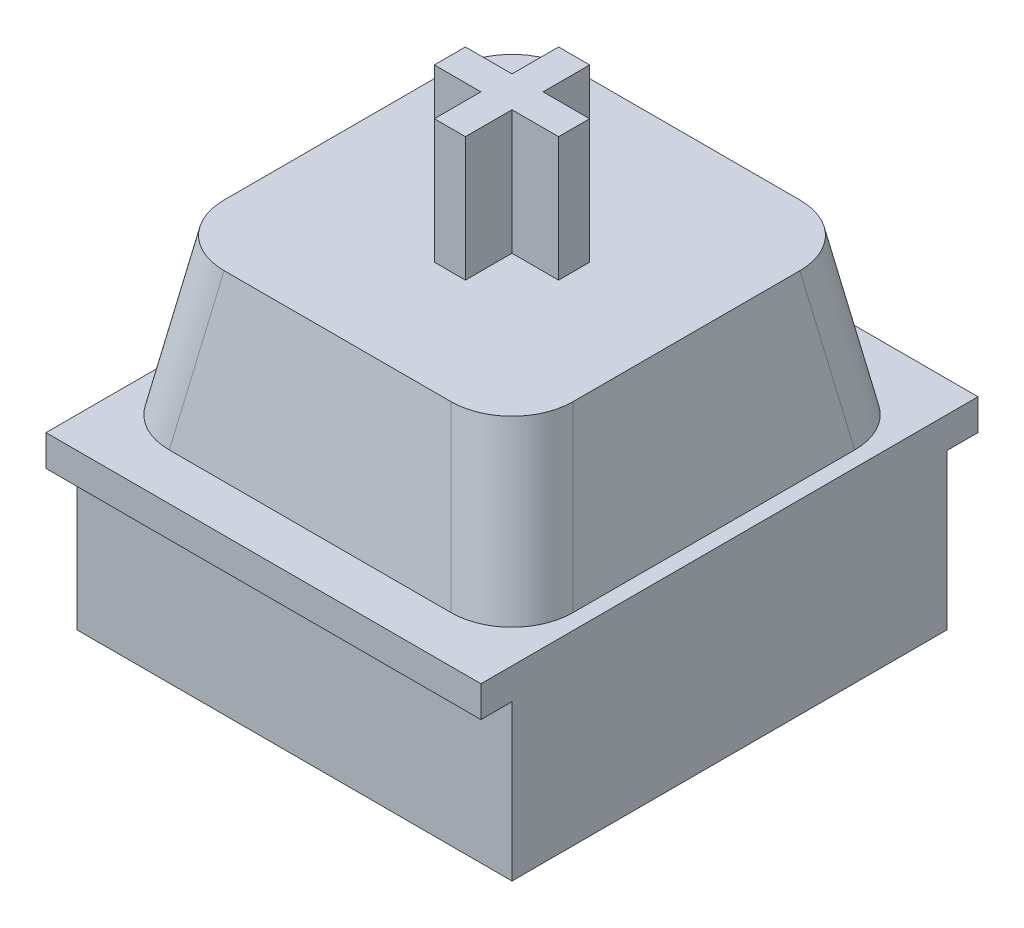
ISO-10303-21;
HEADER;
FILE_DESCRIPTION(('STEP AP214'),'2;1');
FILE_NAME('part.step','',(''),(''),'','','');
FILE_SCHEMA(('AUTOMOTIVE_DESIGN { 1 0 10303 214 1 1 1 1 }'));
ENDSEC;
DATA;
#1=APPLICATION_CONTEXT('core data for automotive mechanical design processes');
#2=APPLICATION_PROTOCOL_DEFINITION('international standard','automotive_design',2000,#1);
#3=PRODUCT_CONTEXT('',#1,'mechanical');
#4=PRODUCT('Part','Part','',(#3));
#5=PRODUCT_RELATED_PRODUCT_CATEGORY('part','',(#4));
#6=PRODUCT_DEFINITION_FORMATION('','',#4);
#7=PRODUCT_DEFINITION_CONTEXT('part definition',#1,'design');
#8=PRODUCT_DEFINITION('design','',#6,#7);
#9=PRODUCT_DEFINITION_SHAPE('','',#8);
#10=(LENGTH_UNIT() NAMED_UNIT(*) SI_UNIT(.MILLI.,.METRE.));
#11=(NAMED_UNIT(*) PLANE_ANGLE_UNIT() SI_UNIT($,.RADIAN.));
#12=(NAMED_UNIT(*) SI_UNIT($,.STERADIAN.) SOLID_ANGLE_UNIT());
#13=UNCERTAINTY_MEASURE_WITH_UNIT(LENGTH_MEASURE(1.E-05),#10,'distance_accuracy_value','');
#14=(GEOMETRIC_REPRESENTATION_CONTEXT(3) GLOBAL_UNCERTAINTY_ASSIGNED_CONTEXT((#13)) GLOBAL_UNIT_ASSIGNED_CONTEXT((#10,
#11,#12)) REPRESENTATION_CONTEXT('',''));
#15=CARTESIAN_POINT('',(0.,0.,0.));
#16=DIRECTION('',(0.,0.,1.));
#17=DIRECTION('',(1.,0.,0.));
#18=AXIS2_PLACEMENT_3D('',#15,#16,#17);
#19=CARTESIAN_POINT('',(0.,11.,0.));
#20=DIRECTION('',(0.,-1.,0.));
#21=DIRECTION('',(0.,0.,-1.));
#22=AXIS2_PLACEMENT_3D('',#19,#20,#21);
#23=PLANE('',#22);
#24=DIRECTION('',(0.,0.,1.));
#25=VECTOR('',#24,1.);
#26=CARTESIAN_POINT('',(5.61836509645767,11.,0.));
#27=LINE('',#26,#25);
#28=CARTESIAN_POINT('',(5.61836509645767,11.,3.64874959043326));
#29=VERTEX_POINT('',#28);
#30=CARTESIAN_POINT('',(5.61836509645767,11.,-3.64874959043326));
#31=VERTEX_POINT('',#30);
#32=EDGE_CURVE('E276',#29,#31,#27,.F.);
#33=ORIENTED_EDGE('',*,*,#32,.T.);
#34=CARTESIAN_POINT('',(3.58751187268619,11.,-3.58751187268618));
#35=DIRECTION('',(0.,-1.,0.));
#36=DIRECTION('',(0.707106781186548,0.,-0.707106781186548));
#37=AXIS2_PLACEMENT_3D('',#34,#35,#36);
#38=ELLIPSE('',#37,2.06124468052827,2.);
#39=CARTESIAN_POINT('',(3.64874959043326,11.,-5.61836509645767));
#40=VERTEX_POINT('',#39);
#41=EDGE_CURVE('E402',#31,#40,#38,.F.);
#42=ORIENTED_EDGE('',*,*,#41,.T.);
#43=DIRECTION('',(1.,0.,0.));
#44=VECTOR('',#43,1.);
#45=CARTESIAN_POINT('',(0.,11.,-5.61836509645767));
#46=LINE('',#45,#44);
#47=CARTESIAN_POINT('',(-3.64874959043326,11.,-5.61836509645767));
#48=VERTEX_POINT('',#47);
#49=EDGE_CURVE('E283',#40,#48,#46,.F.);
#50=ORIENTED_EDGE('',*,*,#49,.T.);
#51=CARTESIAN_POINT('',(-3.58751187268618,11.,-3.58751187268619));
#52=DIRECTION('',(0.,-1.,0.));
#53=DIRECTION('',(-0.707106781186548,0.,-0.707106781186548));
#54=AXIS2_PLACEMENT_3D('',#51,#52,#53);
#55=ELLIPSE('',#54,2.06124468052827,2.);
#56=CARTESIAN_POINT('',(-5.61836509645767,11.,-3.64874959043326));
#57=VERTEX_POINT('',#56);
#58=EDGE_CURVE('E391',#48,#57,#55,.F.);
#59=ORIENTED_EDGE('',*,*,#58,.T.);
#60=DIRECTION('',(0.,0.,-1.));
#61=VECTOR('',#60,1.);
#62=CARTESIAN_POINT('',(-5.61836509645767,11.,0.));
#63=LINE('',#62,#61);
#64=CARTESIAN_POINT('',(-5.61836509645767,11.,3.64874959043326));
#65=VERTEX_POINT('',#64);
#66=EDGE_CURVE('E290',#57,#65,#63,.F.);
#67=ORIENTED_EDGE('',*,*,#66,.T.);
#68=CARTESIAN_POINT('',(-3.58751187268619,11.,3.58751187268619));
#69=DIRECTION('',(0.,-1.,0.));
#70=DIRECTION('',(-0.707106781186548,0.,0.707106781186548));
#71=AXIS2_PLACEMENT_3D('',#68,#69,#70);
#72=ELLIPSE('',#71,2.06124468052827,2.);
#73=CARTESIAN_POINT('',(-3.64874959043326,11.,5.61836509645767));
#74=VERTEX_POINT('',#73);
#75=EDGE_CURVE('E395',#65,#74,#72,.F.);
#76=ORIENTED_EDGE('',*,*,#75,.T.);
#77=DIRECTION('',(-1.,0.,0.));
#78=VECTOR('',#77,1.);
#79=CARTESIAN_POINT('',(0.,11.,5.61836509645767));
#80=LINE('',#79,#78);
#81=CARTESIAN_POINT('',(3.64874959043326,11.,5.61836509645767));
#82=VERTEX_POINT('',#81);
#83=EDGE_CURVE('E293',#74,#82,#80,.F.);
#84=ORIENTED_EDGE('',*,*,#83,.T.);
#85=CARTESIAN_POINT('',(3.58751187268619,11.,3.58751187268619));
#86=DIRECTION('',(0.,-1.,0.));
#87=DIRECTION('',(0.707106781186548,0.,0.707106781186548));
#88=AXIS2_PLACEMENT_3D('',#85,#86,#87);
#89=ELLIPSE('',#88,2.06124468052827,2.);
#90=EDGE_CURVE('E397',#82,#29,#89,.F.);
#91=ORIENTED_EDGE('',*,*,#90,.T.);
#92=EDGE_LOOP('',(#33,#42,#50,#59,#67,#76,#84,#91));
#93=FACE_BOUND('',#92,.T.);
#94=DIRECTION('',(0.,0.,-1.));
#95=VECTOR('',#94,1.);
#96=CARTESIAN_POINT('',(0.5,11.,-0.5));
#97=LINE('',#96,#95);
#98=CARTESIAN_POINT('',(0.5,11.,-0.5));
#99=VERTEX_POINT('',#98);
#100=CARTESIAN_POINT('',(0.5,11.,-2.));
#101=VERTEX_POINT('',#100);
#102=EDGE_CURVE('E257',#99,#101,#97,.T.);
#103=ORIENTED_EDGE('',*,*,#102,.F.);
#104=DIRECTION('',(-1.,0.,0.));
#105=VECTOR('',#104,1.);
#106=CARTESIAN_POINT('',(2.,11.,-0.5));
#107=LINE('',#106,#105);
#108=CARTESIAN_POINT('',(2.,11.,-0.5));
#109=VERTEX_POINT('',#108);
#110=EDGE_CURVE('E254',#109,#99,#107,.T.);
#111=ORIENTED_EDGE('',*,*,#110,.F.);
#112=DIRECTION('',(0.,0.,-1.));
#113=VECTOR('',#112,1.);
#114=CARTESIAN_POINT('',(2.,11.,0.5));
#115=LINE('',#114,#113);
#116=CARTESIAN_POINT('',(2.,11.,0.5));
#117=VERTEX_POINT('',#116);
#118=EDGE_CURVE('E606',#117,#109,#115,.T.);
#119=ORIENTED_EDGE('',*,*,#118,.F.);
#120=DIRECTION('',(1.,0.,0.));
#121=VECTOR('',#120,1.);
#122=CARTESIAN_POINT('',(0.5,11.,0.5));
#123=LINE('',#122,#121);
#124=CARTESIAN_POINT('',(0.5,11.,0.5));
#125=VERTEX_POINT('',#124);
#126=EDGE_CURVE('E607',#125,#117,#123,.T.);
#127=ORIENTED_EDGE('',*,*,#126,.F.);
#128=DIRECTION('',(0.,0.,-1.));
#129=VECTOR('',#128,1.);
#130=CARTESIAN_POINT('',(0.5,11.,2.));
#131=LINE('',#130,#129);
#132=CARTESIAN_POINT('',(0.5,11.,2.));
#133=VERTEX_POINT('',#132);
#134=EDGE_CURVE('E605',#133,#125,#131,.T.);
#135=ORIENTED_EDGE('',*,*,#134,.F.);
#136=DIRECTION('',(1.,0.,0.));
#137=VECTOR('',#136,1.);
#138=CARTESIAN_POINT('',(-0.5,11.,2.));
#139=LINE('',#138,#137);
#140=CARTESIAN_POINT('',(-0.5,11.,2.));
#141=VERTEX_POINT('',#140);
#142=EDGE_CURVE('E596',#141,#133,#139,.T.);
#143=ORIENTED_EDGE('',*,*,#142,.F.);
#144=DIRECTION('',(0.,0.,1.));
#145=VECTOR('',#144,1.);
#146=CARTESIAN_POINT('',(-0.5,11.,0.5));
#147=LINE('',#146,#145);
#148=CARTESIAN_POINT('',(-0.5,11.,0.5));
#149=VERTEX_POINT('',#148);
#150=EDGE_CURVE('E593',#149,#141,#147,.T.);
#151=ORIENTED_EDGE('',*,*,#150,.F.);
#152=DIRECTION('',(1.,0.,0.));
#153=VECTOR('',#152,1.);
#154=CARTESIAN_POINT('',(-2.,11.,0.5));
#155=LINE('',#154,#153);
#156=CARTESIAN_POINT('',(-2.,11.,0.5));
#157=VERTEX_POINT('',#156);
#158=EDGE_CURVE('E586',#157,#149,#155,.T.);
#159=ORIENTED_EDGE('',*,*,#158,.F.);
#160=DIRECTION('',(0.,0.,1.));
#161=VECTOR('',#160,1.);
#162=CARTESIAN_POINT('',(-2.,11.,-0.5));
#163=LINE('',#162,#161);
#164=CARTESIAN_POINT('',(-2.,11.,-0.5));
#165=VERTEX_POINT('',#164);
#166=EDGE_CURVE('E587',#165,#157,#163,.T.);
#167=ORIENTED_EDGE('',*,*,#166,.F.);
#168=DIRECTION('',(-1.,0.,0.));
#169=VECTOR('',#168,1.);
#170=CARTESIAN_POINT('',(-0.5,11.,-0.5));
#171=LINE('',#170,#169);
#172=CARTESIAN_POINT('',(-0.5,11.,-0.5));
#173=VERTEX_POINT('',#172);
#174=EDGE_CURVE('E585',#173,#165,#171,.T.);
#175=ORIENTED_EDGE('',*,*,#174,.F.);
#176=DIRECTION('',(0.,0.,1.));
#177=VECTOR('',#176,1.);
#178=CARTESIAN_POINT('',(-0.5,11.,-2.));
#179=LINE('',#178,#177);
#180=CARTESIAN_POINT('',(-0.5,11.,-2.));
#181=VERTEX_POINT('',#180);
#182=EDGE_CURVE('E579',#181,#173,#179,.T.);
#183=ORIENTED_EDGE('',*,*,#182,.F.);
#184=DIRECTION('',(-1.,0.,0.));
#185=VECTOR('',#184,1.);
#186=CARTESIAN_POINT('',(0.5,11.,-2.));
#187=LINE('',#186,#185);
#188=EDGE_CURVE('E574',#101,#181,#187,.T.);
#189=ORIENTED_EDGE('',*,*,#188,.F.);
#190=EDGE_LOOP('',(#103,#111,#119,#127,#135,#143,#151,#159,#167,#175,#183,#189));
#191=FACE_BOUND('',#190,.T.);
#192=ADVANCED_FACE('F44',(#93,#191),#23,.F.);
#193=CARTESIAN_POINT('',(0.,6.,0.));
#194=DIRECTION('',(0.,-1.,0.));
#195=DIRECTION('',(0.,0.,-1.));
#196=AXIS2_PLACEMENT_3D('',#193,#194,#195);
#197=PLANE('',#196);
#198=DIRECTION('',(0.,0.,-1.));
#199=VECTOR('',#198,1.);
#200=CARTESIAN_POINT('',(7.,6.,8.));
#201=LINE('',#200,#199);
#202=CARTESIAN_POINT('',(7.,6.,8.));
#203=VERTEX_POINT('',#202);
#204=CARTESIAN_POINT('',(7.,6.,-8.));
#205=VERTEX_POINT('',#204);
#206=EDGE_CURVE('E298',#203,#205,#201,.T.);
#207=ORIENTED_EDGE('',*,*,#206,.T.);
#208=DIRECTION('',(-1.,0.,0.));
#209=VECTOR('',#208,1.);
#210=CARTESIAN_POINT('',(-7.,6.,-8.));
#211=LINE('',#210,#209);
#212=CARTESIAN_POINT('',(-7.,6.,-8.));
#213=VERTEX_POINT('',#212);
#214=EDGE_CURVE('E297',#205,#213,#211,.T.);
#215=ORIENTED_EDGE('',*,*,#214,.T.);
#216=DIRECTION('',(0.,0.,1.));
#217=VECTOR('',#216,1.);
#218=CARTESIAN_POINT('',(-7.,6.,8.));
#219=LINE('',#218,#217);
#220=CARTESIAN_POINT('',(-7.,6.,8.));
#221=VERTEX_POINT('',#220);
#222=EDGE_CURVE('E302',#213,#221,#219,.T.);
#223=ORIENTED_EDGE('',*,*,#222,.T.);
#224=DIRECTION('',(1.,0.,0.));
#225=VECTOR('',#224,1.);
#226=CARTESIAN_POINT('',(-7.,6.,8.));
#227=LINE('',#226,#225);
#228=EDGE_CURVE('E310',#221,#203,#227,.T.);
#229=ORIENTED_EDGE('',*,*,#228,.T.);
#230=EDGE_LOOP('',(#207,#215,#223,#229));
#231=FACE_BOUND('',#230,.T.);
#232=DIRECTION('',(0.,0.,-1.));
#233=VECTOR('',#232,1.);
#234=CARTESIAN_POINT('',(6.5,6.,6.5));
#235=LINE('',#234,#233);
#236=CARTESIAN_POINT('',(6.5,6.,4.53038449397558));
#237=VERTEX_POINT('',#236);
#238=CARTESIAN_POINT('',(6.5,6.,-4.53038449397558));
#239=VERTEX_POINT('',#238);
#240=EDGE_CURVE('E259',#237,#239,#235,.T.);
#241=ORIENTED_EDGE('',*,*,#240,.F.);
#242=CARTESIAN_POINT('',(4.46914677622851,6.,4.46914677622851));
#243=DIRECTION('',(0.,-1.,0.));
#244=DIRECTION('',(0.707106781186548,0.,0.707106781186548));
#245=AXIS2_PLACEMENT_3D('',#242,#243,#244);
#246=ELLIPSE('',#245,2.06124468052827,2.);
#247=CARTESIAN_POINT('',(4.53038449397558,6.,6.5));
#248=VERTEX_POINT('',#247);
#249=EDGE_CURVE('E419',#237,#248,#246,.T.);
#250=ORIENTED_EDGE('',*,*,#249,.T.);
#251=DIRECTION('',(1.,0.,0.));
#252=VECTOR('',#251,1.);
#253=CARTESIAN_POINT('',(-6.5,6.,6.5));
#254=LINE('',#253,#252);
#255=CARTESIAN_POINT('',(-4.53038449397558,6.,6.5));
#256=VERTEX_POINT('',#255);
#257=EDGE_CURVE('E273',#256,#248,#254,.T.);
#258=ORIENTED_EDGE('',*,*,#257,.F.);
#259=CARTESIAN_POINT('',(-4.46914677622851,6.,4.46914677622851));
#260=DIRECTION('',(0.,-1.,0.));
#261=DIRECTION('',(-0.707106781186548,0.,0.707106781186548));
#262=AXIS2_PLACEMENT_3D('',#259,#260,#261);
#263=ELLIPSE('',#262,2.06124468052827,2.);
#264=CARTESIAN_POINT('',(-6.5,6.,4.53038449397558));
#265=VERTEX_POINT('',#264);
#266=EDGE_CURVE('E11',#256,#265,#263,.T.);
#267=ORIENTED_EDGE('',*,*,#266,.T.);
#268=DIRECTION('',(0.,0.,1.));
#269=VECTOR('',#268,1.);
#270=CARTESIAN_POINT('',(-6.5,6.,6.5));
#271=LINE('',#270,#269);
#272=CARTESIAN_POINT('',(-6.5,6.,-4.53038449397558));
#273=VERTEX_POINT('',#272);
#274=EDGE_CURVE('E275',#273,#265,#271,.T.);
#275=ORIENTED_EDGE('',*,*,#274,.F.);
#276=CARTESIAN_POINT('',(-4.46914677622851,6.,-4.46914677622851));
#277=DIRECTION('',(0.,-1.,0.));
#278=DIRECTION('',(-0.707106781186548,0.,-0.707106781186548));
#279=AXIS2_PLACEMENT_3D('',#276,#277,#278);
#280=ELLIPSE('',#279,2.06124468052827,2.);
#281=CARTESIAN_POINT('',(-4.53038449397558,6.,-6.5));
#282=VERTEX_POINT('',#281);
#283=EDGE_CURVE('E53',#273,#282,#280,.T.);
#284=ORIENTED_EDGE('',*,*,#283,.T.);
#285=DIRECTION('',(-1.,0.,0.));
#286=VECTOR('',#285,1.);
#287=CARTESIAN_POINT('',(-6.5,6.,-6.5));
#288=LINE('',#287,#286);
#289=CARTESIAN_POINT('',(4.53038449397558,6.,-6.5));
#290=VERTEX_POINT('',#289);
#291=EDGE_CURVE('E263',#290,#282,#288,.T.);
#292=ORIENTED_EDGE('',*,*,#291,.F.);
#293=CARTESIAN_POINT('',(4.46914677622851,6.,-4.46914677622851));
#294=DIRECTION('',(0.,-1.,0.));
#295=DIRECTION('',(0.707106781186548,0.,-0.707106781186548));
#296=AXIS2_PLACEMENT_3D('',#293,#294,#295);
#297=ELLIPSE('',#296,2.06124468052827,2.);
#298=EDGE_CURVE('E420',#290,#239,#297,.T.);
#299=ORIENTED_EDGE('',*,*,#298,.T.);
#300=EDGE_LOOP('',(#241,#250,#258,#267,#275,#284,#292,#299));
#301=FACE_BOUND('',#300,.T.);
#302=ADVANCED_FACE('F424',(#231,#301),#197,.F.);
#303=CARTESIAN_POINT('',(7.,5.,7.));
#304=DIRECTION('',(-1.,0.,0.));
#305=DIRECTION('',(0.,0.,1.));
#306=AXIS2_PLACEMENT_3D('',#303,#304,#305);
#307=PLANE('',#306);
#308=DIRECTION('',(0.,0.,-1.));
#309=VECTOR('',#308,1.);
#310=CARTESIAN_POINT('',(7.,0.,7.));
#311=LINE('',#310,#309);
#312=CARTESIAN_POINT('',(7.,0.,7.));
#313=VERTEX_POINT('',#312);
#314=CARTESIAN_POINT('',(7.,0.,-7.));
#315=VERTEX_POINT('',#314);
#316=EDGE_CURVE('E338',#313,#315,#311,.T.);
#317=ORIENTED_EDGE('',*,*,#316,.T.);
#318=DIRECTION('',(0.,-1.,0.));
#319=VECTOR('',#318,1.);
#320=CARTESIAN_POINT('',(7.,5.,-7.));
#321=LINE('',#320,#319);
#322=CARTESIAN_POINT('',(7.,5.,-7.));
#323=VERTEX_POINT('',#322);
#324=EDGE_CURVE('E373',#323,#315,#321,.T.);
#325=ORIENTED_EDGE('',*,*,#324,.F.);
#326=DIRECTION('',(0.,0.,-1.));
#327=VECTOR('',#326,1.);
#328=CARTESIAN_POINT('',(7.,5.,8.));
#329=LINE('',#328,#327);
#330=CARTESIAN_POINT('',(7.,5.,-8.));
#331=VERTEX_POINT('',#330);
#332=EDGE_CURVE('E294',#323,#331,#329,.T.);
#333=ORIENTED_EDGE('',*,*,#332,.T.);
#334=DIRECTION('',(0.,-1.,0.));
#335=VECTOR('',#334,1.);
#336=CARTESIAN_POINT('',(7.,6.,-8.));
#337=LINE('',#336,#335);
#338=EDGE_CURVE('E337',#205,#331,#337,.T.);
#339=ORIENTED_EDGE('',*,*,#338,.F.);
#340=ORIENTED_EDGE('',*,*,#206,.F.);
#341=DIRECTION('',(0.,-1.,0.));
#342=VECTOR('',#341,1.);
#343=CARTESIAN_POINT('',(7.,6.,8.));
#344=LINE('',#343,#342);
#345=CARTESIAN_POINT('',(7.,5.,8.));
#346=VERTEX_POINT('',#345);
#347=EDGE_CURVE('E309',#203,#346,#344,.T.);
#348=ORIENTED_EDGE('',*,*,#347,.T.);
#349=CARTESIAN_POINT('',(7.,5.,7.));
#350=VERTEX_POINT('',#349);
#351=EDGE_CURVE('E311',#346,#350,#329,.T.);
#352=ORIENTED_EDGE('',*,*,#351,.T.);
#353=DIRECTION('',(0.,-1.,0.));
#354=VECTOR('',#353,1.);
#355=CARTESIAN_POINT('',(7.,5.,7.));
#356=LINE('',#355,#354);
#357=EDGE_CURVE('E346',#350,#313,#356,.T.);
#358=ORIENTED_EDGE('',*,*,#357,.T.);
#359=EDGE_LOOP('',(#317,#325,#333,#339,#340,#348,#352,#358));
#360=FACE_BOUND('',#359,.T.);
#361=ADVANCED_FACE('F471',(#360),#307,.F.);
#362=CARTESIAN_POINT('',(-7.,5.,-7.));
#363=DIRECTION('',(0.,0.,1.));
#364=DIRECTION('',(1.,0.,0.));
#365=AXIS2_PLACEMENT_3D('',#362,#363,#364);
#366=PLANE('',#365);
#367=DIRECTION('',(-1.,0.,0.));
#368=VECTOR('',#367,1.);
#369=CARTESIAN_POINT('',(-7.,0.,-7.));
#370=LINE('',#369,#368);
#371=CARTESIAN_POINT('',(-7.,0.,-7.));
#372=VERTEX_POINT('',#371);
#373=EDGE_CURVE('E353',#315,#372,#370,.T.);
#374=ORIENTED_EDGE('',*,*,#373,.T.);
#375=DIRECTION('',(0.,-1.,0.));
#376=VECTOR('',#375,1.);
#377=CARTESIAN_POINT('',(-7.,5.,-7.));
#378=LINE('',#377,#376);
#379=CARTESIAN_POINT('',(-7.,5.,-7.));
#380=VERTEX_POINT('',#379);
#381=EDGE_CURVE('E367',#380,#372,#378,.T.);
#382=ORIENTED_EDGE('',*,*,#381,.F.);
#383=DIRECTION('',(-1.,0.,0.));
#384=VECTOR('',#383,1.);
#385=CARTESIAN_POINT('',(-7.,5.,-7.));
#386=LINE('',#385,#384);
#387=EDGE_CURVE('E342',#323,#380,#386,.T.);
#388=ORIENTED_EDGE('',*,*,#387,.F.);
#389=ORIENTED_EDGE('',*,*,#324,.T.);
#390=EDGE_LOOP('',(#374,#382,#388,#389));
#391=FACE_BOUND('',#390,.T.);
#392=ADVANCED_FACE('F512',(#391),#366,.F.);
#393=CARTESIAN_POINT('',(-7.,5.,7.));
#394=DIRECTION('',(1.,0.,0.));
#395=DIRECTION('',(0.,0.,-1.));
#396=AXIS2_PLACEMENT_3D('',#393,#394,#395);
#397=PLANE('',#396);
#398=DIRECTION('',(0.,0.,1.));
#399=VECTOR('',#398,1.);
#400=CARTESIAN_POINT('',(-7.,0.,7.));
#401=LINE('',#400,#399);
#402=CARTESIAN_POINT('',(-7.,0.,7.));
#403=VERTEX_POINT('',#402);
#404=EDGE_CURVE('E357',#372,#403,#401,.T.);
#405=ORIENTED_EDGE('',*,*,#404,.T.);
#406=DIRECTION('',(0.,-1.,0.));
#407=VECTOR('',#406,1.);
#408=CARTESIAN_POINT('',(-7.,5.,7.));
#409=LINE('',#408,#407);
#410=CARTESIAN_POINT('',(-7.,5.,7.));
#411=VERTEX_POINT('',#410);
#412=EDGE_CURVE('E362',#411,#403,#409,.T.);
#413=ORIENTED_EDGE('',*,*,#412,.F.);
#414=DIRECTION('',(0.,0.,1.));
#415=VECTOR('',#414,1.);
#416=CARTESIAN_POINT('',(-7.,5.,8.));
#417=LINE('',#416,#415);
#418=CARTESIAN_POINT('',(-7.,5.,8.));
#419=VERTEX_POINT('',#418);
#420=EDGE_CURVE('E319',#411,#419,#417,.T.);
#421=ORIENTED_EDGE('',*,*,#420,.T.);
#422=DIRECTION('',(0.,-1.,0.));
#423=VECTOR('',#422,1.);
#424=CARTESIAN_POINT('',(-7.,6.,8.));
#425=LINE('',#424,#423);
#426=EDGE_CURVE('E328',#221,#419,#425,.T.);
#427=ORIENTED_EDGE('',*,*,#426,.F.);
#428=ORIENTED_EDGE('',*,*,#222,.F.);
#429=DIRECTION('',(0.,-1.,0.));
#430=VECTOR('',#429,1.);
#431=CARTESIAN_POINT('',(-7.,6.,-8.));
#432=LINE('',#431,#430);
#433=CARTESIAN_POINT('',(-7.,5.,-8.));
#434=VERTEX_POINT('',#433);
#435=EDGE_CURVE('E335',#213,#434,#432,.T.);
#436=ORIENTED_EDGE('',*,*,#435,.T.);
#437=EDGE_CURVE('E316',#434,#380,#417,.T.);
#438=ORIENTED_EDGE('',*,*,#437,.T.);
#439=ORIENTED_EDGE('',*,*,#381,.T.);
#440=EDGE_LOOP('',(#405,#413,#421,#427,#428,#436,#438,#439));
#441=FACE_BOUND('',#440,.T.);
#442=ADVANCED_FACE('F510',(#441),#397,.F.);
#443=CARTESIAN_POINT('',(-7.,5.,7.));
#444=DIRECTION('',(0.,0.,-1.));
#445=DIRECTION('',(-1.,0.,0.));
#446=AXIS2_PLACEMENT_3D('',#443,#444,#445);
#447=PLANE('',#446);
#448=DIRECTION('',(1.,0.,0.));
#449=VECTOR('',#448,1.);
#450=CARTESIAN_POINT('',(-7.,0.,7.));
#451=LINE('',#450,#449);
#452=EDGE_CURVE('E347',#403,#313,#451,.T.);
#453=ORIENTED_EDGE('',*,*,#452,.T.);
#454=ORIENTED_EDGE('',*,*,#357,.F.);
#455=DIRECTION('',(1.,0.,0.));
#456=VECTOR('',#455,1.);
#457=CARTESIAN_POINT('',(-7.,5.,7.));
#458=LINE('',#457,#456);
#459=EDGE_CURVE('E343',#411,#350,#458,.T.);
#460=ORIENTED_EDGE('',*,*,#459,.F.);
#461=ORIENTED_EDGE('',*,*,#412,.T.);
#462=EDGE_LOOP('',(#453,#454,#460,#461));
#463=FACE_BOUND('',#462,.T.);
#464=ADVANCED_FACE('F503',(#463),#447,.F.);
#465=CARTESIAN_POINT('',(0.,0.,0.));
#466=DIRECTION('',(0.,-1.,0.));
#467=DIRECTION('',(0.,0.,-1.));
#468=AXIS2_PLACEMENT_3D('',#465,#466,#467);
#469=PLANE('',#468);
#470=CARTESIAN_POINT('',(2.25,0.,-5.));
#471=DIRECTION('',(0.,-1.,0.));
#472=DIRECTION('',(0.,0.,-1.));
#473=AXIS2_PLACEMENT_3D('',#470,#471,#472);
#474=CIRCLE('',#473,0.750000000000001);
#475=CARTESIAN_POINT('',(2.25,0.,-5.75));
#476=VERTEX_POINT('',#475);
#477=EDGE_CURVE('E953',#476,#476,#474,.T.);
#478=ORIENTED_EDGE('',*,*,#477,.F.);
#479=EDGE_LOOP('',(#478));
#480=FACE_BOUND('',#479,.T.);
#481=CARTESIAN_POINT('',(-3.5,0.,-2.75));
#482=DIRECTION('',(0.,-1.,0.));
#483=DIRECTION('',(0.,0.,-1.));
#484=AXIS2_PLACEMENT_3D('',#481,#482,#483);
#485=CIRCLE('',#484,0.75);
#486=CARTESIAN_POINT('',(-3.5,0.,-3.5));
#487=VERTEX_POINT('',#486);
#488=EDGE_CURVE('E954',#487,#487,#485,.T.);
#489=ORIENTED_EDGE('',*,*,#488,.F.);
#490=EDGE_LOOP('',(#489));
#491=FACE_BOUND('',#490,.T.);
#492=CARTESIAN_POINT('',(0.,0.,0.));
#493=DIRECTION('',(0.,-1.,0.));
#494=DIRECTION('',(0.,0.,-1.));
#495=AXIS2_PLACEMENT_3D('',#492,#493,#494);
#496=CIRCLE('',#495,1.75);
#497=CARTESIAN_POINT('',(0.,0.,-1.75));
#498=VERTEX_POINT('',#497);
#499=EDGE_CURVE('E380',#498,#498,#496,.T.);
#500=ORIENTED_EDGE('',*,*,#499,.F.);
#501=EDGE_LOOP('',(#500));
#502=FACE_BOUND('',#501,.T.);
#503=ORIENTED_EDGE('',*,*,#316,.F.);
#504=ORIENTED_EDGE('',*,*,#452,.F.);
#505=ORIENTED_EDGE('',*,*,#404,.F.);
#506=ORIENTED_EDGE('',*,*,#373,.F.);
#507=EDGE_LOOP('',(#503,#504,#505,#506));
#508=FACE_BOUND('',#507,.T.);
#509=ADVANCED_FACE('F499',(#480,#491,#502,#508),#469,.T.);
#510=CARTESIAN_POINT('',(0.,5.,0.));
#511=DIRECTION('',(0.,-1.,0.));
#512=DIRECTION('',(0.,0.,-1.));
#513=AXIS2_PLACEMENT_3D('',#510,#511,#512);
#514=PLANE('',#513);
#515=ORIENTED_EDGE('',*,*,#332,.F.);
#516=ORIENTED_EDGE('',*,*,#387,.T.);
#517=ORIENTED_EDGE('',*,*,#437,.F.);
#518=DIRECTION('',(-1.,0.,0.));
#519=VECTOR('',#518,1.);
#520=CARTESIAN_POINT('',(-7.,5.,-8.));
#521=LINE('',#520,#519);
#522=EDGE_CURVE('E314',#331,#434,#521,.T.);
#523=ORIENTED_EDGE('',*,*,#522,.F.);
#524=EDGE_LOOP('',(#515,#516,#517,#523));
#525=FACE_BOUND('',#524,.T.);
#526=ADVANCED_FACE('F495',(#525),#514,.T.);
#527=CARTESIAN_POINT('',(-7.,6.,-8.));
#528=DIRECTION('',(0.,0.,1.));
#529=DIRECTION('',(1.,0.,0.));
#530=AXIS2_PLACEMENT_3D('',#527,#528,#529);
#531=PLANE('',#530);
#532=ORIENTED_EDGE('',*,*,#522,.T.);
#533=ORIENTED_EDGE('',*,*,#435,.F.);
#534=ORIENTED_EDGE('',*,*,#214,.F.);
#535=ORIENTED_EDGE('',*,*,#338,.T.);
#536=EDGE_LOOP('',(#532,#533,#534,#535));
#537=FACE_BOUND('',#536,.T.);
#538=ADVANCED_FACE('F492',(#537),#531,.F.);
#539=CARTESIAN_POINT('',(-7.,6.,8.));
#540=DIRECTION('',(0.,0.,-1.));
#541=DIRECTION('',(-1.,0.,0.));
#542=AXIS2_PLACEMENT_3D('',#539,#540,#541);
#543=PLANE('',#542);
#544=DIRECTION('',(1.,0.,0.));
#545=VECTOR('',#544,1.);
#546=CARTESIAN_POINT('',(-7.,5.,8.));
#547=LINE('',#546,#545);
#548=EDGE_CURVE('E301',#419,#346,#547,.T.);
#549=ORIENTED_EDGE('',*,*,#548,.T.);
#550=ORIENTED_EDGE('',*,*,#347,.F.);
#551=ORIENTED_EDGE('',*,*,#228,.F.);
#552=ORIENTED_EDGE('',*,*,#426,.T.);
#553=EDGE_LOOP('',(#549,#550,#551,#552));
#554=FACE_BOUND('',#553,.T.);
#555=ADVANCED_FACE('F489',(#554),#543,.F.);
#556=ORIENTED_EDGE('',*,*,#420,.F.);
#557=ORIENTED_EDGE('',*,*,#459,.T.);
#558=ORIENTED_EDGE('',*,*,#351,.F.);
#559=ORIENTED_EDGE('',*,*,#548,.F.);
#560=EDGE_LOOP('',(#556,#557,#558,#559));
#561=FACE_BOUND('',#560,.T.);
#562=ADVANCED_FACE('F485',(#561),#514,.T.);
#563=CARTESIAN_POINT('',(6.5,6.,6.5));
#564=DIRECTION('',(0.984807753012208,0.17364817766693,0.));
#565=DIRECTION('',(-0.17364817766693,0.984807753012208,0.));
#566=AXIS2_PLACEMENT_3D('',#563,#564,#565);
#567=PLANE('',#566);
#568=ORIENTED_EDGE('',*,*,#240,.T.);
#569=DIRECTION('',(-0.171087869746036,0.970287525247814,0.171087869746036));
#570=VECTOR('',#569,1.);
#571=CARTESIAN_POINT('',(6.17712896276226,7.8310926435675,-4.20751345673784));
#572=LINE('',#571,#570);
#573=EDGE_CURVE('E386',#239,#31,#572,.T.);
#574=ORIENTED_EDGE('',*,*,#573,.T.);
#575=ORIENTED_EDGE('',*,*,#32,.F.);
#576=DIRECTION('',(-0.171087869746036,0.970287525247814,-0.171087869746036));
#577=VECTOR('',#576,1.);
#578=CARTESIAN_POINT('',(6.55765273202733,5.67303510900209,4.58803722600292));
#579=LINE('',#578,#577);
#580=EDGE_CURVE('E383',#29,#237,#579,.F.);
#581=ORIENTED_EDGE('',*,*,#580,.T.);
#582=EDGE_LOOP('',(#568,#574,#575,#581));
#583=FACE_BOUND('',#582,.T.);
#584=ADVANCED_FACE('F455',(#583),#567,.T.);
#585=CARTESIAN_POINT('',(-6.5,6.,-6.5));
#586=DIRECTION('',(0.,0.17364817766693,-0.984807753012208));
#587=DIRECTION('',(0.,0.984807753012208,0.17364817766693));
#588=AXIS2_PLACEMENT_3D('',#585,#586,#587);
#589=PLANE('',#588);
#590=ORIENTED_EDGE('',*,*,#49,.F.);
#591=DIRECTION('',(-0.171087869746036,0.970287525247814,0.171087869746036));
#592=VECTOR('',#591,1.);
#593=CARTESIAN_POINT('',(4.20751345673785,7.8310926435675,-6.17712896276226));
#594=LINE('',#593,#592);
#595=EDGE_CURVE('E382',#40,#290,#594,.F.);
#596=ORIENTED_EDGE('',*,*,#595,.T.);
#597=ORIENTED_EDGE('',*,*,#291,.T.);
#598=DIRECTION('',(0.171087869746036,0.970287525247814,0.171087869746036));
#599=VECTOR('',#598,1.);
#600=CARTESIAN_POINT('',(-4.58803722600292,5.67303510900209,-6.55765273202733));
#601=LINE('',#600,#599);
#602=EDGE_CURVE('E377',#282,#48,#601,.T.);
#603=ORIENTED_EDGE('',*,*,#602,.T.);
#604=EDGE_LOOP('',(#590,#596,#597,#603));
#605=FACE_BOUND('',#604,.T.);
#606=ADVANCED_FACE('F426',(#605),#589,.T.);
#607=CARTESIAN_POINT('',(-6.5,6.,6.5));
#608=DIRECTION('',(-0.984807753012208,0.17364817766693,0.));
#609=DIRECTION('',(0.17364817766693,0.984807753012208,0.));
#610=AXIS2_PLACEMENT_3D('',#607,#608,#609);
#611=PLANE('',#610);
#612=ORIENTED_EDGE('',*,*,#66,.F.);
#613=DIRECTION('',(0.171087869746036,0.970287525247814,0.171087869746036));
#614=VECTOR('',#613,1.);
#615=CARTESIAN_POINT('',(-6.17712896276226,7.8310926435675,-4.20751345673785));
#616=LINE('',#615,#614);
#617=EDGE_CURVE('E414',#57,#273,#616,.F.);
#618=ORIENTED_EDGE('',*,*,#617,.T.);
#619=ORIENTED_EDGE('',*,*,#274,.T.);
#620=DIRECTION('',(0.171087869746036,0.970287525247814,-0.171087869746036));
#621=VECTOR('',#620,1.);
#622=CARTESIAN_POINT('',(-6.55765273202733,5.67303510900209,4.58803722600292));
#623=LINE('',#622,#621);
#624=EDGE_CURVE('E412',#265,#65,#623,.T.);
#625=ORIENTED_EDGE('',*,*,#624,.T.);
#626=EDGE_LOOP('',(#612,#618,#619,#625));
#627=FACE_BOUND('',#626,.T.);
#628=ADVANCED_FACE('F440',(#627),#611,.T.);
#629=CARTESIAN_POINT('',(-6.5,6.,6.5));
#630=DIRECTION('',(0.,0.17364817766693,0.984807753012208));
#631=DIRECTION('',(0.,0.984807753012208,-0.17364817766693));
#632=AXIS2_PLACEMENT_3D('',#629,#630,#631);
#633=PLANE('',#632);
#634=ORIENTED_EDGE('',*,*,#257,.T.);
#635=DIRECTION('',(-0.171087869746036,0.970287525247814,-0.171087869746036));
#636=VECTOR('',#635,1.);
#637=CARTESIAN_POINT('',(4.20751345673784,7.8310926435675,6.17712896276226));
#638=LINE('',#637,#636);
#639=EDGE_CURVE('E409',#248,#82,#638,.T.);
#640=ORIENTED_EDGE('',*,*,#639,.T.);
#641=ORIENTED_EDGE('',*,*,#83,.F.);
#642=DIRECTION('',(0.171087869746036,0.970287525247814,-0.171087869746036));
#643=VECTOR('',#642,1.);
#644=CARTESIAN_POINT('',(-4.58803722600292,5.67303510900209,6.55765273202733));
#645=LINE('',#644,#643);
#646=EDGE_CURVE('E404',#74,#256,#645,.F.);
#647=ORIENTED_EDGE('',*,*,#646,.T.);
#648=EDGE_LOOP('',(#634,#640,#641,#647));
#649=FACE_BOUND('',#648,.T.);
#650=ADVANCED_FACE('F443',(#649),#633,.T.);
#651=CARTESIAN_POINT('',(0.5,15.,-0.5));
#652=DIRECTION('',(-1.,0.,0.));
#653=DIRECTION('',(0.,0.,1.));
#654=AXIS2_PLACEMENT_3D('',#651,#652,#653);
#655=PLANE('',#654);
#656=ORIENTED_EDGE('',*,*,#102,.T.);
#657=DIRECTION('',(0.,-1.,0.));
#658=VECTOR('',#657,1.);
#659=CARTESIAN_POINT('',(0.5,15.,-2.));
#660=LINE('',#659,#658);
#661=CARTESIAN_POINT('',(0.5,15.,-2.));
#662=VERTEX_POINT('',#661);
#663=EDGE_CURVE('E232',#662,#101,#660,.T.);
#664=ORIENTED_EDGE('',*,*,#663,.F.);
#665=DIRECTION('',(0.,0.,-1.));
#666=VECTOR('',#665,1.);
#667=CARTESIAN_POINT('',(0.5,15.,-0.5));
#668=LINE('',#667,#666);
#669=CARTESIAN_POINT('',(0.5,15.,-0.5));
#670=VERTEX_POINT('',#669);
#671=EDGE_CURVE('E243',#670,#662,#668,.T.);
#672=ORIENTED_EDGE('',*,*,#671,.F.);
#673=DIRECTION('',(0.,-1.,0.));
#674=VECTOR('',#673,1.);
#675=CARTESIAN_POINT('',(0.5,15.,-0.5));
#676=LINE('',#675,#674);
#677=EDGE_CURVE('E575',#670,#99,#676,.T.);
#678=ORIENTED_EDGE('',*,*,#677,.T.);
#679=EDGE_LOOP('',(#656,#664,#672,#678));
#680=FACE_BOUND('',#679,.T.);
#681=ADVANCED_FACE('F253',(#680),#655,.F.);
#682=CARTESIAN_POINT('',(0.5,15.,-2.));
#683=DIRECTION('',(0.,0.,1.));
#684=DIRECTION('',(1.,0.,0.));
#685=AXIS2_PLACEMENT_3D('',#682,#683,#684);
#686=PLANE('',#685);
#687=ORIENTED_EDGE('',*,*,#188,.T.);
#688=DIRECTION('',(0.,-1.,0.));
#689=VECTOR('',#688,1.);
#690=CARTESIAN_POINT('',(-0.5,15.,-2.));
#691=LINE('',#690,#689);
#692=CARTESIAN_POINT('',(-0.5,15.,-2.));
#693=VERTEX_POINT('',#692);
#694=EDGE_CURVE('E238',#693,#181,#691,.T.);
#695=ORIENTED_EDGE('',*,*,#694,.F.);
#696=DIRECTION('',(-1.,0.,0.));
#697=VECTOR('',#696,1.);
#698=CARTESIAN_POINT('',(0.5,15.,-2.));
#699=LINE('',#698,#697);
#700=EDGE_CURVE('E229',#662,#693,#699,.T.);
#701=ORIENTED_EDGE('',*,*,#700,.F.);
#702=ORIENTED_EDGE('',*,*,#663,.T.);
#703=EDGE_LOOP('',(#687,#695,#701,#702));
#704=FACE_BOUND('',#703,.T.);
#705=ADVANCED_FACE('F231',(#704),#686,.F.);
#706=CARTESIAN_POINT('',(-0.5,15.,-2.));
#707=DIRECTION('',(1.,0.,0.));
#708=DIRECTION('',(0.,0.,-1.));
#709=AXIS2_PLACEMENT_3D('',#706,#707,#708);
#710=PLANE('',#709);
#711=ORIENTED_EDGE('',*,*,#182,.T.);
#712=DIRECTION('',(0.,-1.,0.));
#713=VECTOR('',#712,1.);
#714=CARTESIAN_POINT('',(-0.5,15.,-0.5));
#715=LINE('',#714,#713);
#716=CARTESIAN_POINT('',(-0.5,15.,-0.5));
#717=VERTEX_POINT('',#716);
#718=EDGE_CURVE('E261',#717,#173,#715,.T.);
#719=ORIENTED_EDGE('',*,*,#718,.F.);
#720=DIRECTION('',(0.,0.,1.));
#721=VECTOR('',#720,1.);
#722=CARTESIAN_POINT('',(-0.5,15.,-2.));
#723=LINE('',#722,#721);
#724=EDGE_CURVE('E245',#693,#717,#723,.T.);
#725=ORIENTED_EDGE('',*,*,#724,.F.);
#726=ORIENTED_EDGE('',*,*,#694,.T.);
#727=EDGE_LOOP('',(#711,#719,#725,#726));
#728=FACE_BOUND('',#727,.T.);
#729=ADVANCED_FACE('F657',(#728),#710,.F.);
#730=CARTESIAN_POINT('',(-0.5,15.,-0.5));
#731=DIRECTION('',(0.,0.,1.));
#732=DIRECTION('',(1.,0.,0.));
#733=AXIS2_PLACEMENT_3D('',#730,#731,#732);
#734=PLANE('',#733);
#735=ORIENTED_EDGE('',*,*,#174,.T.);
#736=DIRECTION('',(0.,-1.,0.));
#737=VECTOR('',#736,1.);
#738=CARTESIAN_POINT('',(-2.,15.,-0.5));
#739=LINE('',#738,#737);
#740=CARTESIAN_POINT('',(-2.,15.,-0.5));
#741=VERTEX_POINT('',#740);
#742=EDGE_CURVE('E650',#741,#165,#739,.T.);
#743=ORIENTED_EDGE('',*,*,#742,.F.);
#744=DIRECTION('',(-1.,0.,0.));
#745=VECTOR('',#744,1.);
#746=CARTESIAN_POINT('',(-0.5,15.,-0.5));
#747=LINE('',#746,#745);
#748=EDGE_CURVE('E546',#717,#741,#747,.T.);
#749=ORIENTED_EDGE('',*,*,#748,.F.);
#750=ORIENTED_EDGE('',*,*,#718,.T.);
#751=EDGE_LOOP('',(#735,#743,#749,#750));
#752=FACE_BOUND('',#751,.T.);
#753=ADVANCED_FACE('F651',(#752),#734,.F.);
#754=CARTESIAN_POINT('',(-2.,15.,-0.5));
#755=DIRECTION('',(1.,0.,0.));
#756=DIRECTION('',(0.,0.,-1.));
#757=AXIS2_PLACEMENT_3D('',#754,#755,#756);
#758=PLANE('',#757);
#759=ORIENTED_EDGE('',*,*,#166,.T.);
#760=DIRECTION('',(0.,-1.,0.));
#761=VECTOR('',#760,1.);
#762=CARTESIAN_POINT('',(-2.,15.,0.5));
#763=LINE('',#762,#761);
#764=CARTESIAN_POINT('',(-2.,15.,0.5));
#765=VERTEX_POINT('',#764);
#766=EDGE_CURVE('E644',#765,#157,#763,.T.);
#767=ORIENTED_EDGE('',*,*,#766,.F.);
#768=DIRECTION('',(0.,0.,1.));
#769=VECTOR('',#768,1.);
#770=CARTESIAN_POINT('',(-2.,15.,-0.5));
#771=LINE('',#770,#769);
#772=EDGE_CURVE('E548',#741,#765,#771,.T.);
#773=ORIENTED_EDGE('',*,*,#772,.F.);
#774=ORIENTED_EDGE('',*,*,#742,.T.);
#775=EDGE_LOOP('',(#759,#767,#773,#774));
#776=FACE_BOUND('',#775,.T.);
#777=ADVANCED_FACE('F662',(#776),#758,.F.);
#778=CARTESIAN_POINT('',(-2.,15.,0.5));
#779=DIRECTION('',(0.,0.,-1.));
#780=DIRECTION('',(-1.,0.,0.));
#781=AXIS2_PLACEMENT_3D('',#778,#779,#780);
#782=PLANE('',#781);
#783=ORIENTED_EDGE('',*,*,#158,.T.);
#784=DIRECTION('',(0.,-1.,0.));
#785=VECTOR('',#784,1.);
#786=CARTESIAN_POINT('',(-0.5,15.,0.5));
#787=LINE('',#786,#785);
#788=CARTESIAN_POINT('',(-0.5,15.,0.5));
#789=VERTEX_POINT('',#788);
#790=EDGE_CURVE('E638',#789,#149,#787,.T.);
#791=ORIENTED_EDGE('',*,*,#790,.F.);
#792=DIRECTION('',(1.,0.,0.));
#793=VECTOR('',#792,1.);
#794=CARTESIAN_POINT('',(-2.,15.,0.5));
#795=LINE('',#794,#793);
#796=EDGE_CURVE('E552',#765,#789,#795,.T.);
#797=ORIENTED_EDGE('',*,*,#796,.F.);
#798=ORIENTED_EDGE('',*,*,#766,.T.);
#799=EDGE_LOOP('',(#783,#791,#797,#798));
#800=FACE_BOUND('',#799,.T.);
#801=ADVANCED_FACE('F663',(#800),#782,.F.);
#802=CARTESIAN_POINT('',(-0.5,15.,0.5));
#803=DIRECTION('',(1.,0.,0.));
#804=DIRECTION('',(0.,0.,-1.));
#805=AXIS2_PLACEMENT_3D('',#802,#803,#804);
#806=PLANE('',#805);
#807=ORIENTED_EDGE('',*,*,#150,.T.);
#808=DIRECTION('',(0.,-1.,0.));
#809=VECTOR('',#808,1.);
#810=CARTESIAN_POINT('',(-0.5,15.,2.));
#811=LINE('',#810,#809);
#812=CARTESIAN_POINT('',(-0.5,15.,2.));
#813=VERTEX_POINT('',#812);
#814=EDGE_CURVE('E634',#813,#141,#811,.T.);
#815=ORIENTED_EDGE('',*,*,#814,.F.);
#816=DIRECTION('',(0.,0.,1.));
#817=VECTOR('',#816,1.);
#818=CARTESIAN_POINT('',(-0.5,15.,0.5));
#819=LINE('',#818,#817);
#820=EDGE_CURVE('E554',#789,#813,#819,.T.);
#821=ORIENTED_EDGE('',*,*,#820,.F.);
#822=ORIENTED_EDGE('',*,*,#790,.T.);
#823=EDGE_LOOP('',(#807,#815,#821,#822));
#824=FACE_BOUND('',#823,.T.);
#825=ADVANCED_FACE('F675',(#824),#806,.F.);
#826=CARTESIAN_POINT('',(-0.5,15.,2.));
#827=DIRECTION('',(0.,0.,-1.));
#828=DIRECTION('',(-1.,0.,0.));
#829=AXIS2_PLACEMENT_3D('',#826,#827,#828);
#830=PLANE('',#829);
#831=ORIENTED_EDGE('',*,*,#142,.T.);
#832=DIRECTION('',(0.,-1.,0.));
#833=VECTOR('',#832,1.);
#834=CARTESIAN_POINT('',(0.5,15.,2.));
#835=LINE('',#834,#833);
#836=CARTESIAN_POINT('',(0.5,15.,2.));
#837=VERTEX_POINT('',#836);
#838=EDGE_CURVE('E631',#837,#133,#835,.T.);
#839=ORIENTED_EDGE('',*,*,#838,.F.);
#840=DIRECTION('',(1.,0.,0.));
#841=VECTOR('',#840,1.);
#842=CARTESIAN_POINT('',(-0.5,15.,2.));
#843=LINE('',#842,#841);
#844=EDGE_CURVE('E556',#813,#837,#843,.T.);
#845=ORIENTED_EDGE('',*,*,#844,.F.);
#846=ORIENTED_EDGE('',*,*,#814,.T.);
#847=EDGE_LOOP('',(#831,#839,#845,#846));
#848=FACE_BOUND('',#847,.T.);
#849=ADVANCED_FACE('F674',(#848),#830,.F.);
#850=CARTESIAN_POINT('',(0.5,15.,2.));
#851=DIRECTION('',(-1.,0.,0.));
#852=DIRECTION('',(0.,0.,1.));
#853=AXIS2_PLACEMENT_3D('',#850,#851,#852);
#854=PLANE('',#853);
#855=ORIENTED_EDGE('',*,*,#134,.T.);
#856=DIRECTION('',(0.,-1.,0.));
#857=VECTOR('',#856,1.);
#858=CARTESIAN_POINT('',(0.5,15.,0.5));
#859=LINE('',#858,#857);
#860=CARTESIAN_POINT('',(0.5,15.,0.5));
#861=VERTEX_POINT('',#860);
#862=EDGE_CURVE('E630',#861,#125,#859,.T.);
#863=ORIENTED_EDGE('',*,*,#862,.F.);
#864=DIRECTION('',(0.,0.,-1.));
#865=VECTOR('',#864,1.);
#866=CARTESIAN_POINT('',(0.5,15.,2.));
#867=LINE('',#866,#865);
#868=EDGE_CURVE('E561',#837,#861,#867,.T.);
#869=ORIENTED_EDGE('',*,*,#868,.F.);
#870=ORIENTED_EDGE('',*,*,#838,.T.);
#871=EDGE_LOOP('',(#855,#863,#869,#870));
#872=FACE_BOUND('',#871,.T.);
#873=ADVANCED_FACE('F677',(#872),#854,.F.);
#874=CARTESIAN_POINT('',(0.5,15.,0.5));
#875=DIRECTION('',(0.,0.,-1.));
#876=DIRECTION('',(-1.,0.,0.));
#877=AXIS2_PLACEMENT_3D('',#874,#875,#876);
#878=PLANE('',#877);
#879=ORIENTED_EDGE('',*,*,#126,.T.);
#880=DIRECTION('',(0.,-1.,0.));
#881=VECTOR('',#880,1.);
#882=CARTESIAN_POINT('',(2.,15.,0.5));
#883=LINE('',#882,#881);
#884=CARTESIAN_POINT('',(2.,15.,0.5));
#885=VERTEX_POINT('',#884);
#886=EDGE_CURVE('E621',#885,#117,#883,.T.);
#887=ORIENTED_EDGE('',*,*,#886,.F.);
#888=DIRECTION('',(1.,0.,0.));
#889=VECTOR('',#888,1.);
#890=CARTESIAN_POINT('',(0.5,15.,0.5));
#891=LINE('',#890,#889);
#892=EDGE_CURVE('E562',#861,#885,#891,.T.);
#893=ORIENTED_EDGE('',*,*,#892,.F.);
#894=ORIENTED_EDGE('',*,*,#862,.T.);
#895=EDGE_LOOP('',(#879,#887,#893,#894));
#896=FACE_BOUND('',#895,.T.);
#897=ADVANCED_FACE('F685',(#896),#878,.F.);
#898=CARTESIAN_POINT('',(2.,15.,0.5));
#899=DIRECTION('',(-1.,0.,0.));
#900=DIRECTION('',(0.,0.,1.));
#901=AXIS2_PLACEMENT_3D('',#898,#899,#900);
#902=PLANE('',#901);
#903=ORIENTED_EDGE('',*,*,#118,.T.);
#904=DIRECTION('',(0.,-1.,0.));
#905=VECTOR('',#904,1.);
#906=CARTESIAN_POINT('',(2.,15.,-0.5));
#907=LINE('',#906,#905);
#908=CARTESIAN_POINT('',(2.,15.,-0.5));
#909=VERTEX_POINT('',#908);
#910=EDGE_CURVE('E620',#909,#109,#907,.T.);
#911=ORIENTED_EDGE('',*,*,#910,.F.);
#912=DIRECTION('',(0.,0.,-1.));
#913=VECTOR('',#912,1.);
#914=CARTESIAN_POINT('',(2.,15.,0.5));
#915=LINE('',#914,#913);
#916=EDGE_CURVE('E570',#885,#909,#915,.T.);
#917=ORIENTED_EDGE('',*,*,#916,.F.);
#918=ORIENTED_EDGE('',*,*,#886,.T.);
#919=EDGE_LOOP('',(#903,#911,#917,#918));
#920=FACE_BOUND('',#919,.T.);
#921=ADVANCED_FACE('F688',(#920),#902,.F.);
#922=CARTESIAN_POINT('',(2.,15.,-0.5));
#923=DIRECTION('',(0.,0.,1.));
#924=DIRECTION('',(1.,0.,0.));
#925=AXIS2_PLACEMENT_3D('',#922,#923,#924);
#926=PLANE('',#925);
#927=ORIENTED_EDGE('',*,*,#110,.T.);
#928=ORIENTED_EDGE('',*,*,#677,.F.);
#929=DIRECTION('',(-1.,0.,0.));
#930=VECTOR('',#929,1.);
#931=CARTESIAN_POINT('',(2.,15.,-0.5));
#932=LINE('',#931,#930);
#933=EDGE_CURVE('E247',#909,#670,#932,.T.);
#934=ORIENTED_EDGE('',*,*,#933,.F.);
#935=ORIENTED_EDGE('',*,*,#910,.T.);
#936=EDGE_LOOP('',(#927,#928,#934,#935));
#937=FACE_BOUND('',#936,.T.);
#938=ADVANCED_FACE('F686',(#937),#926,.F.);
#939=CARTESIAN_POINT('',(0.,15.,0.));
#940=DIRECTION('',(0.,1.,0.));
#941=DIRECTION('',(0.,0.,1.));
#942=AXIS2_PLACEMENT_3D('',#939,#940,#941);
#943=PLANE('',#942);
#944=ORIENTED_EDGE('',*,*,#671,.T.);
#945=ORIENTED_EDGE('',*,*,#700,.T.);
#946=ORIENTED_EDGE('',*,*,#724,.T.);
#947=ORIENTED_EDGE('',*,*,#748,.T.);
#948=ORIENTED_EDGE('',*,*,#772,.T.);
#949=ORIENTED_EDGE('',*,*,#796,.T.);
#950=ORIENTED_EDGE('',*,*,#820,.T.);
#951=ORIENTED_EDGE('',*,*,#844,.T.);
#952=ORIENTED_EDGE('',*,*,#868,.T.);
#953=ORIENTED_EDGE('',*,*,#892,.T.);
#954=ORIENTED_EDGE('',*,*,#916,.T.);
#955=ORIENTED_EDGE('',*,*,#933,.T.);
#956=EDGE_LOOP('',(#944,#945,#946,#947,#948,#949,#950,#951,#952,#953,#954,#955));
#957=FACE_BOUND('',#956,.T.);
#958=ADVANCED_FACE('F246',(#957),#943,.T.);
#959=CARTESIAN_POINT('',(0.,-3.,0.));
#960=DIRECTION('',(0.,1.,0.));
#961=DIRECTION('',(0.,0.,1.));
#962=AXIS2_PLACEMENT_3D('',#959,#960,#961);
#963=CYLINDRICAL_SURFACE('',#962,1.75);
#964=CARTESIAN_POINT('',(0.,-3.,0.));
#965=DIRECTION('',(0.,-1.,0.));
#966=DIRECTION('',(0.,0.,-1.));
#967=AXIS2_PLACEMENT_3D('',#964,#965,#966);
#968=CIRCLE('',#967,1.75);
#969=CARTESIAN_POINT('',(0.,-3.,-1.75));
#970=VERTEX_POINT('',#969);
#971=EDGE_CURVE('E542',#970,#970,#968,.T.);
#972=ORIENTED_EDGE('',*,*,#971,.F.);
#973=EDGE_LOOP('',(#972));
#974=FACE_BOUND('',#973,.T.);
#975=ORIENTED_EDGE('',*,*,#499,.T.);
#976=EDGE_LOOP('',(#975));
#977=FACE_BOUND('',#976,.T.);
#978=ADVANCED_FACE('F694',(#974,#977),#963,.T.);
#979=CARTESIAN_POINT('',(0.,-3.,0.));
#980=DIRECTION('',(0.,-1.,0.));
#981=DIRECTION('',(0.,0.,-1.));
#982=AXIS2_PLACEMENT_3D('',#979,#980,#981);
#983=PLANE('',#982);
#984=ORIENTED_EDGE('',*,*,#971,.T.);
#985=EDGE_LOOP('',(#984));
#986=FACE_BOUND('',#985,.T.);
#987=ADVANCED_FACE('F872',(#986),#983,.T.);
#988=CARTESIAN_POINT('',(-3.5,-3.,-2.75));
#989=DIRECTION('',(0.,1.,0.));
#990=DIRECTION('',(0.,0.,1.));
#991=AXIS2_PLACEMENT_3D('',#988,#989,#990);
#992=CYLINDRICAL_SURFACE('',#991,0.75);
#993=CARTESIAN_POINT('',(-3.5,-3.,-2.75));
#994=DIRECTION('',(0.,-1.,0.));
#995=DIRECTION('',(0.,0.,-1.));
#996=AXIS2_PLACEMENT_3D('',#993,#994,#995);
#997=CIRCLE('',#996,0.75);
#998=CARTESIAN_POINT('',(-3.5,-3.,-3.5));
#999=VERTEX_POINT('',#998);
#1000=EDGE_CURVE('E961',#999,#999,#997,.T.);
#1001=ORIENTED_EDGE('',*,*,#1000,.F.);
#1002=EDGE_LOOP('',(#1001));
#1003=FACE_BOUND('',#1002,.T.);
#1004=ORIENTED_EDGE('',*,*,#488,.T.);
#1005=EDGE_LOOP('',(#1004));
#1006=FACE_BOUND('',#1005,.T.);
#1007=ADVANCED_FACE('F883',(#1003,#1006),#992,.T.);
#1008=CARTESIAN_POINT('',(-3.5,-3.,-2.75));
#1009=DIRECTION('',(0.,-1.,0.));
#1010=DIRECTION('',(0.,0.,-1.));
#1011=AXIS2_PLACEMENT_3D('',#1008,#1009,#1010);
#1012=PLANE('',#1011);
#1013=ORIENTED_EDGE('',*,*,#1000,.T.);
#1014=EDGE_LOOP('',(#1013));
#1015=FACE_BOUND('',#1014,.T.);
#1016=ADVANCED_FACE('F889',(#1015),#1012,.T.);
#1017=CARTESIAN_POINT('',(2.25,-3.,-5.));
#1018=DIRECTION('',(0.,1.,0.));
#1019=DIRECTION('',(0.,0.,1.));
#1020=AXIS2_PLACEMENT_3D('',#1017,#1018,#1019);
#1021=CYLINDRICAL_SURFACE('',#1020,0.750000000000001);
#1022=CARTESIAN_POINT('',(2.25,-3.,-5.));
#1023=DIRECTION('',(0.,-1.,0.));
#1024=DIRECTION('',(0.,0.,-1.));
#1025=AXIS2_PLACEMENT_3D('',#1022,#1023,#1024);
#1026=CIRCLE('',#1025,0.750000000000001);
#1027=CARTESIAN_POINT('',(2.25,-3.,-5.75));
#1028=VERTEX_POINT('',#1027);
#1029=EDGE_CURVE('E947',#1028,#1028,#1026,.T.);
#1030=ORIENTED_EDGE('',*,*,#1029,.F.);
#1031=EDGE_LOOP('',(#1030));
#1032=FACE_BOUND('',#1031,.T.);
#1033=ORIENTED_EDGE('',*,*,#477,.T.);
#1034=EDGE_LOOP('',(#1033));
#1035=FACE_BOUND('',#1034,.T.);
#1036=ADVANCED_FACE('F464',(#1032,#1035),#1021,.T.);
#1037=CARTESIAN_POINT('',(2.25,-3.,-5.));
#1038=DIRECTION('',(0.,-1.,0.));
#1039=DIRECTION('',(0.,0.,-1.));
#1040=AXIS2_PLACEMENT_3D('',#1037,#1038,#1039);
#1041=PLANE('',#1040);
#1042=ORIENTED_EDGE('',*,*,#1029,.T.);
#1043=EDGE_LOOP('',(#1042));
#1044=FACE_BOUND('',#1043,.T.);
#1045=ADVANCED_FACE('F460',(#1044),#1041,.T.);
#1046=CARTESIAN_POINT('',(4.20751345673785,7.48379628823364,-4.20751345673784));
#1047=DIRECTION('',(0.171087869746036,-0.970287525247814,-0.171087869746036));
#1048=DIRECTION('',(0.,0.17364817766693,-0.984807753012208));
#1049=AXIS2_PLACEMENT_3D('',#1046,#1047,#1048);
#1050=CYLINDRICAL_SURFACE('',#1049,2.);
#1051=ORIENTED_EDGE('',*,*,#41,.F.);
#1052=ORIENTED_EDGE('',*,*,#573,.F.);
#1053=ORIENTED_EDGE('',*,*,#298,.F.);
#1054=ORIENTED_EDGE('',*,*,#595,.F.);
#1055=EDGE_LOOP('',(#1051,#1052,#1053,#1054));
#1056=FACE_BOUND('',#1055,.T.);
#1057=ADVANCED_FACE('F453',(#1056),#1050,.T.);
#1058=CARTESIAN_POINT('',(4.58803722600292,5.32573875366823,4.58803722600292));
#1059=DIRECTION('',(0.171087869746036,-0.970287525247814,0.171087869746036));
#1060=DIRECTION('',(0.,-0.17364817766693,-0.984807753012208));
#1061=AXIS2_PLACEMENT_3D('',#1058,#1059,#1060);
#1062=CYLINDRICAL_SURFACE('',#1061,2.);
#1063=ORIENTED_EDGE('',*,*,#90,.F.);
#1064=ORIENTED_EDGE('',*,*,#639,.F.);
#1065=ORIENTED_EDGE('',*,*,#249,.F.);
#1066=ORIENTED_EDGE('',*,*,#580,.F.);
#1067=EDGE_LOOP('',(#1063,#1064,#1065,#1066));
#1068=FACE_BOUND('',#1067,.T.);
#1069=ADVANCED_FACE('F450',(#1068),#1062,.T.);
#1070=CARTESIAN_POINT('',(-4.20751345673784,7.48379628823364,-4.20751345673785));
#1071=DIRECTION('',(-0.171087869746036,-0.970287525247814,-0.171087869746036));
#1072=DIRECTION('',(0.,0.17364817766693,-0.984807753012208));
#1073=AXIS2_PLACEMENT_3D('',#1070,#1071,#1072);
#1074=CYLINDRICAL_SURFACE('',#1073,2.);
#1075=ORIENTED_EDGE('',*,*,#58,.F.);
#1076=ORIENTED_EDGE('',*,*,#602,.F.);
#1077=ORIENTED_EDGE('',*,*,#283,.F.);
#1078=ORIENTED_EDGE('',*,*,#617,.F.);
#1079=EDGE_LOOP('',(#1075,#1076,#1077,#1078));
#1080=FACE_BOUND('',#1079,.T.);
#1081=ADVANCED_FACE('F431',(#1080),#1074,.T.);
#1082=CARTESIAN_POINT('',(-4.58803722600292,5.32573875366823,4.58803722600292));
#1083=DIRECTION('',(-0.171087869746036,-0.970287525247814,0.171087869746036));
#1084=DIRECTION('',(0.,-0.17364817766693,-0.984807753012208));
#1085=AXIS2_PLACEMENT_3D('',#1082,#1083,#1084);
#1086=CYLINDRICAL_SURFACE('',#1085,2.);
#1087=ORIENTED_EDGE('',*,*,#75,.F.);
#1088=ORIENTED_EDGE('',*,*,#624,.F.);
#1089=ORIENTED_EDGE('',*,*,#266,.F.);
#1090=ORIENTED_EDGE('',*,*,#646,.F.);
#1091=EDGE_LOOP('',(#1087,#1088,#1089,#1090));
#1092=FACE_BOUND('',#1091,.T.);
#1093=ADVANCED_FACE('F50',(#1092),#1086,.T.);
#1094=CLOSED_SHELL('',(#192,#302,#361,#392,#442,#464,#509,#526,#538,#555,#562,#584,#606,#628,
#650,#681,#705,#729,#753,#777,#801,#825,#849,#873,#897,#921,#938,#958,#978,#987,#1007,#1016,
#1036,#1045,#1057,#1069,#1081,#1093));
#1095=MANIFOLD_SOLID_BREP('B2',#1094);
#1096=ADVANCED_BREP_SHAPE_REPRESENTATION('',(#18,#1095),#14);
#1097=SHAPE_DEFINITION_REPRESENTATION(#9,#1096);
ENDSEC;
END-ISO-10303-21;
